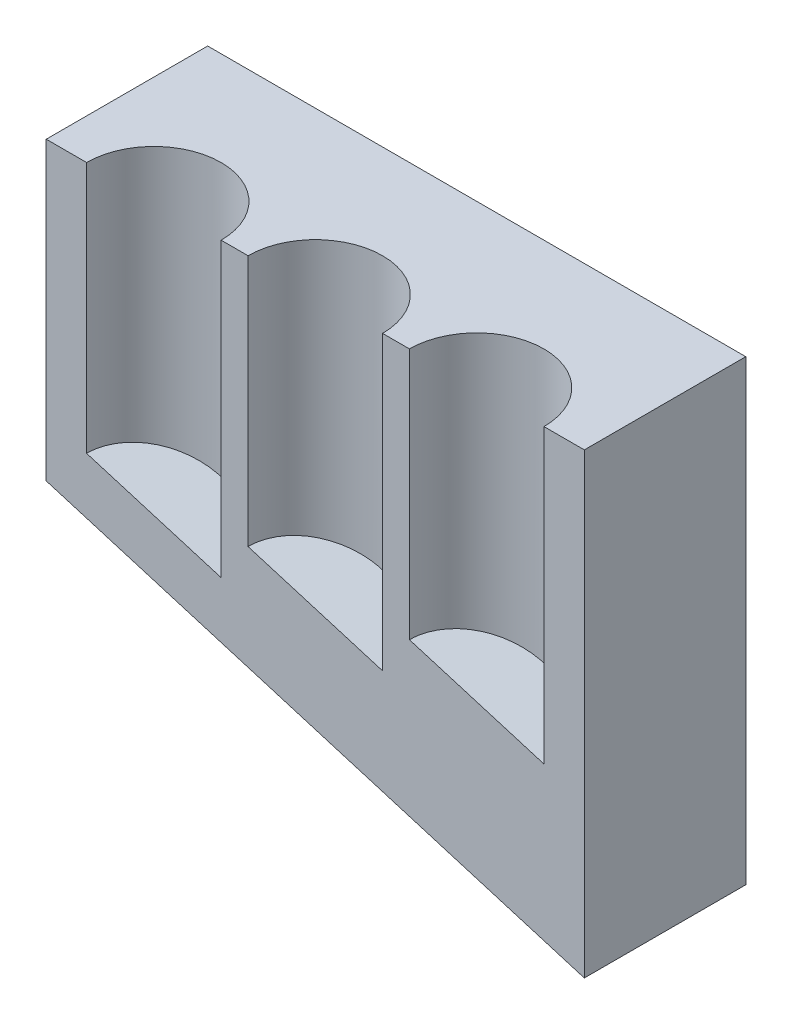
ISO-10303-21;
HEADER;
FILE_DESCRIPTION(('STEP AP214'),'2;1');
FILE_NAME('part.step','',(''),(''),'','','');
FILE_SCHEMA(('AUTOMOTIVE_DESIGN { 1 0 10303 214 1 1 1 1 }'));
ENDSEC;
DATA;
#1=APPLICATION_CONTEXT('core data for automotive mechanical design processes');
#2=APPLICATION_PROTOCOL_DEFINITION('international standard','automotive_design',2000,#1);
#3=PRODUCT_CONTEXT('',#1,'mechanical');
#4=PRODUCT('Part','Part','',(#3));
#5=PRODUCT_RELATED_PRODUCT_CATEGORY('part','',(#4));
#6=PRODUCT_DEFINITION_FORMATION('','',#4);
#7=PRODUCT_DEFINITION_CONTEXT('part definition',#1,'design');
#8=PRODUCT_DEFINITION('design','',#6,#7);
#9=PRODUCT_DEFINITION_SHAPE('','',#8);
#10=(LENGTH_UNIT() NAMED_UNIT(*) SI_UNIT(.MILLI.,.METRE.));
#11=(NAMED_UNIT(*) PLANE_ANGLE_UNIT() SI_UNIT($,.RADIAN.));
#12=(NAMED_UNIT(*) SI_UNIT($,.STERADIAN.) SOLID_ANGLE_UNIT());
#13=UNCERTAINTY_MEASURE_WITH_UNIT(LENGTH_MEASURE(1.E-05),#10,'distance_accuracy_value','');
#14=(GEOMETRIC_REPRESENTATION_CONTEXT(3) GLOBAL_UNCERTAINTY_ASSIGNED_CONTEXT((#13)) GLOBAL_UNIT_ASSIGNED_CONTEXT((#10,
#11,#12)) REPRESENTATION_CONTEXT('',''));
#15=CARTESIAN_POINT('',(0.,0.,0.));
#16=DIRECTION('',(0.,0.,1.));
#17=DIRECTION('',(1.,0.,0.));
#18=AXIS2_PLACEMENT_3D('',#15,#16,#17);
#19=CARTESIAN_POINT('',(0.,0.,30.));
#20=DIRECTION('',(1.,0.,0.));
#21=DIRECTION('',(0.,0.,-1.));
#22=AXIS2_PLACEMENT_3D('',#19,#20,#21);
#23=PLANE('',#22);
#24=DIRECTION('',(0.,-1.,0.));
#25=VECTOR('',#24,1.);
#26=CARTESIAN_POINT('',(0.,0.,0.));
#27=LINE('',#26,#25);
#28=CARTESIAN_POINT('',(0.,55.,0.));
#29=VERTEX_POINT('',#28);
#30=CARTESIAN_POINT('',(0.,0.,0.));
#31=VERTEX_POINT('',#30);
#32=EDGE_CURVE('E165',#29,#31,#27,.T.);
#33=ORIENTED_EDGE('',*,*,#32,.T.);
#34=DIRECTION('',(0.,0.,-1.));
#35=VECTOR('',#34,1.);
#36=CARTESIAN_POINT('',(0.,0.,30.));
#37=LINE('',#36,#35);
#38=CARTESIAN_POINT('',(0.,0.,30.));
#39=VERTEX_POINT('',#38);
#40=EDGE_CURVE('E204',#39,#31,#37,.T.);
#41=ORIENTED_EDGE('',*,*,#40,.F.);
#42=DIRECTION('',(0.,-1.,0.));
#43=VECTOR('',#42,1.);
#44=CARTESIAN_POINT('',(0.,0.,30.));
#45=LINE('',#44,#43);
#46=CARTESIAN_POINT('',(0.,55.,30.));
#47=VERTEX_POINT('',#46);
#48=EDGE_CURVE('E166',#47,#39,#45,.T.);
#49=ORIENTED_EDGE('',*,*,#48,.F.);
#50=DIRECTION('',(0.,0.,-1.));
#51=VECTOR('',#50,1.);
#52=CARTESIAN_POINT('',(0.,55.,30.));
#53=LINE('',#52,#51);
#54=EDGE_CURVE('E180',#47,#29,#53,.T.);
#55=ORIENTED_EDGE('',*,*,#54,.T.);
#56=EDGE_LOOP('',(#33,#41,#49,#55));
#57=FACE_BOUND('',#56,.T.);
#58=ADVANCED_FACE('F41',(#57),#23,.F.);
#59=CARTESIAN_POINT('',(0.,0.,30.));
#60=DIRECTION('',(0.287347885566345,0.957826285221151,0.));
#61=DIRECTION('',(-0.957826285221151,0.287347885566345,0.));
#62=AXIS2_PLACEMENT_3D('',#59,#60,#61);
#63=PLANE('',#62);
#64=DIRECTION('',(0.957826285221151,-0.287347885566345,0.));
#65=VECTOR('',#64,1.);
#66=CARTESIAN_POINT('',(0.,0.,0.));
#67=LINE('',#66,#65);
#68=CARTESIAN_POINT('',(100.,-30.,0.));
#69=VERTEX_POINT('',#68);
#70=EDGE_CURVE('E185',#31,#69,#67,.T.);
#71=ORIENTED_EDGE('',*,*,#70,.T.);
#72=DIRECTION('',(0.,0.,-1.));
#73=VECTOR('',#72,1.);
#74=CARTESIAN_POINT('',(100.,-30.,30.));
#75=LINE('',#74,#73);
#76=CARTESIAN_POINT('',(100.,-30.,30.));
#77=VERTEX_POINT('',#76);
#78=EDGE_CURVE('E200',#77,#69,#75,.T.);
#79=ORIENTED_EDGE('',*,*,#78,.F.);
#80=DIRECTION('',(0.957826285221151,-0.287347885566345,0.));
#81=VECTOR('',#80,1.);
#82=CARTESIAN_POINT('',(0.,0.,30.));
#83=LINE('',#82,#81);
#84=EDGE_CURVE('E170',#39,#77,#83,.T.);
#85=ORIENTED_EDGE('',*,*,#84,.F.);
#86=ORIENTED_EDGE('',*,*,#40,.T.);
#87=EDGE_LOOP('',(#71,#79,#85,#86));
#88=FACE_BOUND('',#87,.T.);
#89=ADVANCED_FACE('F245',(#88),#63,.F.);
#90=CARTESIAN_POINT('',(100.,-30.,30.));
#91=DIRECTION('',(-1.,0.,0.));
#92=DIRECTION('',(0.,0.,1.));
#93=AXIS2_PLACEMENT_3D('',#90,#91,#92);
#94=PLANE('',#93);
#95=DIRECTION('',(0.,1.,0.));
#96=VECTOR('',#95,1.);
#97=CARTESIAN_POINT('',(100.,-30.,0.));
#98=LINE('',#97,#96);
#99=CARTESIAN_POINT('',(100.,55.,0.));
#100=VERTEX_POINT('',#99);
#101=EDGE_CURVE('E188',#69,#100,#98,.T.);
#102=ORIENTED_EDGE('',*,*,#101,.T.);
#103=DIRECTION('',(0.,0.,-1.));
#104=VECTOR('',#103,1.);
#105=CARTESIAN_POINT('',(100.,55.,30.));
#106=LINE('',#105,#104);
#107=CARTESIAN_POINT('',(100.,55.,30.));
#108=VERTEX_POINT('',#107);
#109=EDGE_CURVE('E196',#108,#100,#106,.T.);
#110=ORIENTED_EDGE('',*,*,#109,.F.);
#111=DIRECTION('',(0.,1.,0.));
#112=VECTOR('',#111,1.);
#113=CARTESIAN_POINT('',(100.,-30.,30.));
#114=LINE('',#113,#112);
#115=EDGE_CURVE('E174',#77,#108,#114,.T.);
#116=ORIENTED_EDGE('',*,*,#115,.F.);
#117=ORIENTED_EDGE('',*,*,#78,.T.);
#118=EDGE_LOOP('',(#102,#110,#116,#117));
#119=FACE_BOUND('',#118,.T.);
#120=ADVANCED_FACE('F250',(#119),#94,.F.);
#121=CARTESIAN_POINT('',(0.,55.,30.));
#122=DIRECTION('',(0.,-1.,0.));
#123=DIRECTION('',(0.,0.,-1.));
#124=AXIS2_PLACEMENT_3D('',#121,#122,#123);
#125=PLANE('',#124);
#126=DIRECTION('',(-1.,0.,0.));
#127=VECTOR('',#126,1.);
#128=CARTESIAN_POINT('',(0.,55.,30.));
#129=LINE('',#128,#127);
#130=CARTESIAN_POINT('',(67.5,55.,30.));
#131=VERTEX_POINT('',#130);
#132=CARTESIAN_POINT('',(62.5,55.,30.));
#133=VERTEX_POINT('',#132);
#134=EDGE_CURVE('E181',#131,#133,#129,.T.);
#135=ORIENTED_EDGE('',*,*,#134,.F.);
#136=CARTESIAN_POINT('',(80.,55.,30.));
#137=DIRECTION('',(0.,1.,0.));
#138=DIRECTION('',(0.,0.,1.));
#139=AXIS2_PLACEMENT_3D('',#136,#137,#138);
#140=CIRCLE('',#139,12.5);
#141=CARTESIAN_POINT('',(92.5,55.,30.));
#142=VERTEX_POINT('',#141);
#143=EDGE_CURVE('E136',#142,#131,#140,.T.);
#144=ORIENTED_EDGE('',*,*,#143,.F.);
#145=EDGE_CURVE('E134',#108,#142,#129,.T.);
#146=ORIENTED_EDGE('',*,*,#145,.F.);
#147=ORIENTED_EDGE('',*,*,#109,.T.);
#148=DIRECTION('',(-1.,0.,0.));
#149=VECTOR('',#148,1.);
#150=CARTESIAN_POINT('',(0.,55.,0.));
#151=LINE('',#150,#149);
#152=EDGE_CURVE('E171',#100,#29,#151,.T.);
#153=ORIENTED_EDGE('',*,*,#152,.T.);
#154=ORIENTED_EDGE('',*,*,#54,.F.);
#155=CARTESIAN_POINT('',(7.50000000000001,55.,30.));
#156=VERTEX_POINT('',#155);
#157=EDGE_CURVE('E177',#156,#47,#129,.T.);
#158=ORIENTED_EDGE('',*,*,#157,.F.);
#159=CARTESIAN_POINT('',(20.,55.,30.));
#160=DIRECTION('',(0.,1.,0.));
#161=DIRECTION('',(0.,0.,1.));
#162=AXIS2_PLACEMENT_3D('',#159,#160,#161);
#163=CIRCLE('',#162,12.5);
#164=CARTESIAN_POINT('',(32.5,55.,30.));
#165=VERTEX_POINT('',#164);
#166=EDGE_CURVE('E158',#165,#156,#163,.T.);
#167=ORIENTED_EDGE('',*,*,#166,.F.);
#168=CARTESIAN_POINT('',(37.5,55.,30.));
#169=VERTEX_POINT('',#168);
#170=EDGE_CURVE('E215',#169,#165,#129,.T.);
#171=ORIENTED_EDGE('',*,*,#170,.F.);
#172=CARTESIAN_POINT('',(50.,55.,30.));
#173=DIRECTION('',(0.,1.,0.));
#174=DIRECTION('',(0.,0.,1.));
#175=AXIS2_PLACEMENT_3D('',#172,#173,#174);
#176=CIRCLE('',#175,12.5);
#177=EDGE_CURVE('E153',#133,#169,#176,.T.);
#178=ORIENTED_EDGE('',*,*,#177,.F.);
#179=EDGE_LOOP('',(#135,#144,#146,#147,#153,#154,#158,#167,#171,#178));
#180=FACE_BOUND('',#179,.T.);
#181=ADVANCED_FACE('F223',(#180),#125,.F.);
#182=CARTESIAN_POINT('',(0.,55.,30.));
#183=DIRECTION('',(0.,0.,-1.));
#184=DIRECTION('',(-1.,0.,0.));
#185=AXIS2_PLACEMENT_3D('',#182,#183,#184);
#186=PLANE('',#185);
#187=DIRECTION('',(0.957826285221151,-0.287347885566345,0.));
#188=VECTOR('',#187,1.);
#189=CARTESIAN_POINT('',(47.7358641767644,14.1195472558812,30.));
#190=LINE('',#189,#188);
#191=CARTESIAN_POINT('',(67.5,8.19030650891054,30.));
#192=VERTEX_POINT('',#191);
#193=CARTESIAN_POINT('',(92.5,0.690306508910542,30.));
#194=VERTEX_POINT('',#193);
#195=EDGE_CURVE('E119',#192,#194,#190,.T.);
#196=ORIENTED_EDGE('',*,*,#195,.F.);
#197=DIRECTION('',(0.,1.,0.));
#198=VECTOR('',#197,1.);
#199=CARTESIAN_POINT('',(67.5,-41.6933918460449,30.));
#200=LINE('',#199,#198);
#201=EDGE_CURVE('E56',#192,#131,#200,.T.);
#202=ORIENTED_EDGE('',*,*,#201,.T.);
#203=ORIENTED_EDGE('',*,*,#134,.T.);
#204=DIRECTION('',(0.,1.,0.));
#205=VECTOR('',#204,1.);
#206=CARTESIAN_POINT('',(62.5,-41.6933918460449,30.));
#207=LINE('',#206,#205);
#208=CARTESIAN_POINT('',(62.5,0.690306508910542,30.));
#209=VERTEX_POINT('',#208);
#210=EDGE_CURVE('E149',#133,#209,#207,.F.);
#211=ORIENTED_EDGE('',*,*,#210,.T.);
#212=DIRECTION('',(0.957826285221151,-0.287347885566345,0.));
#213=VECTOR('',#212,1.);
#214=CARTESIAN_POINT('',(17.7358641767644,14.1195472558812,30.));
#215=LINE('',#214,#213);
#216=CARTESIAN_POINT('',(37.5,8.19030650891053,30.));
#217=VERTEX_POINT('',#216);
#218=EDGE_CURVE('E143',#217,#209,#215,.T.);
#219=ORIENTED_EDGE('',*,*,#218,.F.);
#220=DIRECTION('',(0.,1.,0.));
#221=VECTOR('',#220,1.);
#222=CARTESIAN_POINT('',(37.5,-41.6933918460449,30.));
#223=LINE('',#222,#221);
#224=EDGE_CURVE('E64',#217,#169,#223,.T.);
#225=ORIENTED_EDGE('',*,*,#224,.T.);
#226=ORIENTED_EDGE('',*,*,#170,.T.);
#227=DIRECTION('',(0.,1.,0.));
#228=VECTOR('',#227,1.);
#229=CARTESIAN_POINT('',(32.5,-41.6933918460449,30.));
#230=LINE('',#229,#228);
#231=CARTESIAN_POINT('',(32.5,0.690306508910542,30.));
#232=VERTEX_POINT('',#231);
#233=EDGE_CURVE('E49',#165,#232,#230,.F.);
#234=ORIENTED_EDGE('',*,*,#233,.T.);
#235=DIRECTION('',(0.957826285221151,-0.287347885566345,0.));
#236=VECTOR('',#235,1.);
#237=CARTESIAN_POINT('',(-12.2641358232356,14.1195472558812,30.));
#238=LINE('',#237,#236);
#239=CARTESIAN_POINT('',(7.50000000000001,8.19030650891054,30.));
#240=VERTEX_POINT('',#239);
#241=EDGE_CURVE('E208',#240,#232,#238,.T.);
#242=ORIENTED_EDGE('',*,*,#241,.F.);
#243=DIRECTION('',(0.,1.,0.));
#244=VECTOR('',#243,1.);
#245=CARTESIAN_POINT('',(7.50000000000001,-41.6933918460449,30.));
#246=LINE('',#245,#244);
#247=EDGE_CURVE('E12',#240,#156,#246,.T.);
#248=ORIENTED_EDGE('',*,*,#247,.T.);
#249=ORIENTED_EDGE('',*,*,#157,.T.);
#250=ORIENTED_EDGE('',*,*,#48,.T.);
#251=ORIENTED_EDGE('',*,*,#84,.T.);
#252=ORIENTED_EDGE('',*,*,#115,.T.);
#253=ORIENTED_EDGE('',*,*,#145,.T.);
#254=DIRECTION('',(0.,1.,0.));
#255=VECTOR('',#254,1.);
#256=CARTESIAN_POINT('',(92.5,-41.6933918460449,30.));
#257=LINE('',#256,#255);
#258=EDGE_CURVE('E127',#142,#194,#257,.F.);
#259=ORIENTED_EDGE('',*,*,#258,.T.);
#260=EDGE_LOOP('',(#196,#202,#203,#211,#219,#225,#226,#234,#242,#248,#249,#250,#251,#252,#253,#259));
#261=FACE_BOUND('',#260,.T.);
#262=ADVANCED_FACE('F132',(#261),#186,.F.);
#263=CARTESIAN_POINT('',(0.,55.,0.));
#264=DIRECTION('',(0.,0.,-1.));
#265=DIRECTION('',(-1.,0.,0.));
#266=AXIS2_PLACEMENT_3D('',#263,#264,#265);
#267=PLANE('',#266);
#268=ORIENTED_EDGE('',*,*,#32,.F.);
#269=ORIENTED_EDGE('',*,*,#152,.F.);
#270=ORIENTED_EDGE('',*,*,#101,.F.);
#271=ORIENTED_EDGE('',*,*,#70,.F.);
#272=EDGE_LOOP('',(#268,#269,#270,#271));
#273=FACE_BOUND('',#272,.T.);
#274=ADVANCED_FACE('F256',(#273),#267,.T.);
#275=CARTESIAN_POINT('',(20.,-41.6933918460449,30.));
#276=DIRECTION('',(0.,1.,0.));
#277=DIRECTION('',(0.,0.,1.));
#278=AXIS2_PLACEMENT_3D('',#275,#276,#277);
#279=CYLINDRICAL_SURFACE('',#278,12.5);
#280=CARTESIAN_POINT('',(20.,4.44030650891055,30.));
#281=DIRECTION('',(0.287347885566345,0.957826285221151,0.));
#282=DIRECTION('',(-0.957826285221151,0.287347885566345,0.));
#283=AXIS2_PLACEMENT_3D('',#280,#281,#282);
#284=ELLIPSE('',#283,13.0503831361382,12.5);
#285=EDGE_CURVE('E161',#240,#232,#284,.F.);
#286=ORIENTED_EDGE('',*,*,#285,.T.);
#287=ORIENTED_EDGE('',*,*,#233,.F.);
#288=ORIENTED_EDGE('',*,*,#166,.T.);
#289=ORIENTED_EDGE('',*,*,#247,.F.);
#290=EDGE_LOOP('',(#286,#287,#288,#289));
#291=FACE_BOUND('',#290,.T.);
#292=ADVANCED_FACE('F218',(#291),#279,.F.);
#293=CARTESIAN_POINT('',(2.87347885566346,9.57826285221151,30.));
#294=DIRECTION('',(0.287347885566345,0.957826285221151,0.));
#295=DIRECTION('',(-0.957826285221151,0.287347885566345,0.));
#296=AXIS2_PLACEMENT_3D('',#293,#294,#295);
#297=PLANE('',#296);
#298=ORIENTED_EDGE('',*,*,#241,.T.);
#299=ORIENTED_EDGE('',*,*,#285,.F.);
#300=EDGE_LOOP('',(#298,#299));
#301=FACE_BOUND('',#300,.T.);
#302=ADVANCED_FACE('F242',(#301),#297,.T.);
#303=CARTESIAN_POINT('',(50.,-41.6933918460449,30.));
#304=DIRECTION('',(0.,1.,0.));
#305=DIRECTION('',(0.,0.,1.));
#306=AXIS2_PLACEMENT_3D('',#303,#304,#305);
#307=CYLINDRICAL_SURFACE('',#306,12.5);
#308=CARTESIAN_POINT('',(50.,4.44030650891055,30.));
#309=DIRECTION('',(0.287347885566345,0.957826285221151,0.));
#310=DIRECTION('',(-0.957826285221151,0.287347885566345,0.));
#311=AXIS2_PLACEMENT_3D('',#308,#309,#310);
#312=ELLIPSE('',#311,13.0503831361382,12.5);
#313=EDGE_CURVE('E146',#217,#209,#312,.F.);
#314=ORIENTED_EDGE('',*,*,#313,.T.);
#315=ORIENTED_EDGE('',*,*,#210,.F.);
#316=ORIENTED_EDGE('',*,*,#177,.T.);
#317=ORIENTED_EDGE('',*,*,#224,.F.);
#318=EDGE_LOOP('',(#314,#315,#316,#317));
#319=FACE_BOUND('',#318,.T.);
#320=ADVANCED_FACE('F232',(#319),#307,.F.);
#321=CARTESIAN_POINT('',(32.8734788556635,9.57826285221151,30.));
#322=DIRECTION('',(0.287347885566345,0.957826285221151,0.));
#323=DIRECTION('',(-0.957826285221151,0.287347885566345,0.));
#324=AXIS2_PLACEMENT_3D('',#321,#322,#323);
#325=PLANE('',#324);
#326=ORIENTED_EDGE('',*,*,#218,.T.);
#327=ORIENTED_EDGE('',*,*,#313,.F.);
#328=EDGE_LOOP('',(#326,#327));
#329=FACE_BOUND('',#328,.T.);
#330=ADVANCED_FACE('F234',(#329),#325,.T.);
#331=CARTESIAN_POINT('',(80.,-41.6933918460449,30.));
#332=DIRECTION('',(0.,1.,0.));
#333=DIRECTION('',(0.,0.,1.));
#334=AXIS2_PLACEMENT_3D('',#331,#332,#333);
#335=CYLINDRICAL_SURFACE('',#334,12.5);
#336=CARTESIAN_POINT('',(80.,4.44030650891055,30.));
#337=DIRECTION('',(0.287347885566345,0.957826285221151,0.));
#338=DIRECTION('',(-0.957826285221151,0.287347885566345,0.));
#339=AXIS2_PLACEMENT_3D('',#336,#337,#338);
#340=ELLIPSE('',#339,13.0503831361382,12.5);
#341=EDGE_CURVE('E121',#192,#194,#340,.F.);
#342=ORIENTED_EDGE('',*,*,#341,.T.);
#343=ORIENTED_EDGE('',*,*,#258,.F.);
#344=ORIENTED_EDGE('',*,*,#143,.T.);
#345=ORIENTED_EDGE('',*,*,#201,.F.);
#346=EDGE_LOOP('',(#342,#343,#344,#345));
#347=FACE_BOUND('',#346,.T.);
#348=ADVANCED_FACE('F126',(#347),#335,.F.);
#349=CARTESIAN_POINT('',(62.8734788556634,9.57826285221151,30.));
#350=DIRECTION('',(0.287347885566345,0.957826285221151,0.));
#351=DIRECTION('',(-0.957826285221151,0.287347885566345,0.));
#352=AXIS2_PLACEMENT_3D('',#349,#350,#351);
#353=PLANE('',#352);
#354=ORIENTED_EDGE('',*,*,#195,.T.);
#355=ORIENTED_EDGE('',*,*,#341,.F.);
#356=EDGE_LOOP('',(#354,#355));
#357=FACE_BOUND('',#356,.T.);
#358=ADVANCED_FACE('F120',(#357),#353,.T.);
#359=CLOSED_SHELL('',(#58,#89,#120,#181,#262,#274,#292,#302,#320,#330,#348,#358));
#360=MANIFOLD_SOLID_BREP('B2',#359);
#361=ADVANCED_BREP_SHAPE_REPRESENTATION('',(#18,#360),#14);
#362=SHAPE_DEFINITION_REPRESENTATION(#9,#361);
ENDSEC;
END-ISO-10303-21;
